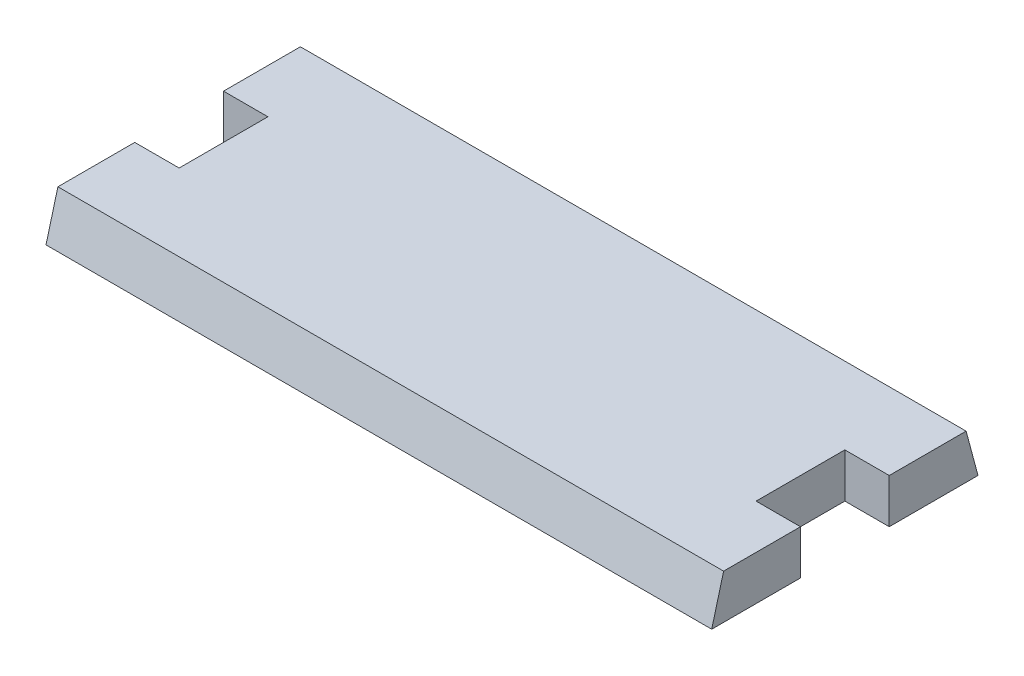
ISO-10303-21;
HEADER;
FILE_DESCRIPTION(('STEP AP214'),'2;1');
FILE_NAME('part.step','',(''),(''),'','','');
FILE_SCHEMA(('AUTOMOTIVE_DESIGN { 1 0 10303 214 1 1 1 1 }'));
ENDSEC;
DATA;
#1=APPLICATION_CONTEXT('core data for automotive mechanical design processes');
#2=APPLICATION_PROTOCOL_DEFINITION('international standard','automotive_design',2000,#1);
#3=PRODUCT_CONTEXT('',#1,'mechanical');
#4=PRODUCT('Part','Part','',(#3));
#5=PRODUCT_RELATED_PRODUCT_CATEGORY('part','',(#4));
#6=PRODUCT_DEFINITION_FORMATION('','',#4);
#7=PRODUCT_DEFINITION_CONTEXT('part definition',#1,'design');
#8=PRODUCT_DEFINITION('design','',#6,#7);
#9=PRODUCT_DEFINITION_SHAPE('','',#8);
#10=(LENGTH_UNIT() NAMED_UNIT(*) SI_UNIT(.MILLI.,.METRE.));
#11=(NAMED_UNIT(*) PLANE_ANGLE_UNIT() SI_UNIT($,.RADIAN.));
#12=(NAMED_UNIT(*) SI_UNIT($,.STERADIAN.) SOLID_ANGLE_UNIT());
#13=UNCERTAINTY_MEASURE_WITH_UNIT(LENGTH_MEASURE(1.E-05),#10,'distance_accuracy_value','');
#14=(GEOMETRIC_REPRESENTATION_CONTEXT(3) GLOBAL_UNCERTAINTY_ASSIGNED_CONTEXT((#13)) GLOBAL_UNIT_ASSIGNED_CONTEXT((#10,
#11,#12)) REPRESENTATION_CONTEXT('',''));
#15=CARTESIAN_POINT('',(0.,0.,0.));
#16=DIRECTION('',(0.,0.,1.));
#17=DIRECTION('',(1.,0.,0.));
#18=AXIS2_PLACEMENT_3D('',#15,#16,#17);
#19=CARTESIAN_POINT('',(-75.,0.,-30.));
#20=DIRECTION('',(0.,0.258819045102521,-0.965925826289068));
#21=DIRECTION('',(0.,0.965925826289068,0.258819045102521));
#22=AXIS2_PLACEMENT_3D('',#19,#20,#21);
#23=PLANE('',#22);
#24=DIRECTION('',(-1.,0.,0.));
#25=VECTOR('',#24,1.);
#26=CARTESIAN_POINT('',(-75.,0.,-30.));
#27=LINE('',#26,#25);
#28=CARTESIAN_POINT('',(75.,0.,-30.));
#29=VERTEX_POINT('',#28);
#30=CARTESIAN_POINT('',(-75.,0.,-30.));
#31=VERTEX_POINT('',#30);
#32=EDGE_CURVE('E150',#29,#31,#27,.T.);
#33=ORIENTED_EDGE('',*,*,#32,.T.);
#34=DIRECTION('',(0.,0.965925826289068,0.258819045102521));
#35=VECTOR('',#34,1.);
#36=CARTESIAN_POINT('',(-75.,14.3301270189222,-26.1602540378444));
#37=LINE('',#36,#35);
#38=CARTESIAN_POINT('',(-75.,10.,-27.3205080756888));
#39=VERTEX_POINT('',#38);
#40=EDGE_CURVE('E11',#39,#31,#37,.F.);
#41=ORIENTED_EDGE('',*,*,#40,.F.);
#42=DIRECTION('',(1.,0.,0.));
#43=VECTOR('',#42,1.);
#44=CARTESIAN_POINT('',(-75.,10.,-27.3205080756888));
#45=LINE('',#44,#43);
#46=CARTESIAN_POINT('',(75.,10.,-27.3205080756888));
#47=VERTEX_POINT('',#46);
#48=EDGE_CURVE('E145',#47,#39,#45,.F.);
#49=ORIENTED_EDGE('',*,*,#48,.F.);
#50=DIRECTION('',(0.,0.965925826289068,0.258819045102521));
#51=VECTOR('',#50,1.);
#52=CARTESIAN_POINT('',(75.,0.,-30.));
#53=LINE('',#52,#51);
#54=EDGE_CURVE('E139',#47,#29,#53,.F.);
#55=ORIENTED_EDGE('',*,*,#54,.T.);
#56=EDGE_LOOP('',(#33,#41,#49,#55));
#57=FACE_BOUND('',#56,.T.);
#58=ADVANCED_FACE('F39',(#57),#23,.T.);
#59=CARTESIAN_POINT('',(-75.,10.,-10.));
#60=DIRECTION('',(1.,0.,0.));
#61=DIRECTION('',(0.,0.,-1.));
#62=AXIS2_PLACEMENT_3D('',#59,#60,#61);
#63=PLANE('',#62);
#64=DIRECTION('',(0.,0.,1.));
#65=VECTOR('',#64,1.);
#66=CARTESIAN_POINT('',(-75.,0.,-10.));
#67=LINE('',#66,#65);
#68=CARTESIAN_POINT('',(-75.,0.,-10.));
#69=VERTEX_POINT('',#68);
#70=EDGE_CURVE('E155',#31,#69,#67,.T.);
#71=ORIENTED_EDGE('',*,*,#70,.T.);
#72=DIRECTION('',(0.,-1.,0.));
#73=VECTOR('',#72,1.);
#74=CARTESIAN_POINT('',(-75.,10.,-10.));
#75=LINE('',#74,#73);
#76=CARTESIAN_POINT('',(-75.,10.,-10.));
#77=VERTEX_POINT('',#76);
#78=EDGE_CURVE('E50',#77,#69,#75,.T.);
#79=ORIENTED_EDGE('',*,*,#78,.F.);
#80=DIRECTION('',(0.,0.,1.));
#81=VECTOR('',#80,1.);
#82=CARTESIAN_POINT('',(-75.,10.,-10.));
#83=LINE('',#82,#81);
#84=EDGE_CURVE('E219',#39,#77,#83,.T.);
#85=ORIENTED_EDGE('',*,*,#84,.F.);
#86=ORIENTED_EDGE('',*,*,#40,.T.);
#87=EDGE_LOOP('',(#71,#79,#85,#86));
#88=FACE_BOUND('',#87,.T.);
#89=ADVANCED_FACE('F278',(#88),#63,.F.);
#90=CARTESIAN_POINT('',(-75.,10.,-10.));
#91=DIRECTION('',(0.,0.,-1.));
#92=DIRECTION('',(-1.,0.,0.));
#93=AXIS2_PLACEMENT_3D('',#90,#91,#92);
#94=PLANE('',#93);
#95=DIRECTION('',(1.,0.,0.));
#96=VECTOR('',#95,1.);
#97=CARTESIAN_POINT('',(-75.,0.,-10.));
#98=LINE('',#97,#96);
#99=CARTESIAN_POINT('',(-65.,0.,-10.));
#100=VERTEX_POINT('',#99);
#101=EDGE_CURVE('E159',#69,#100,#98,.T.);
#102=ORIENTED_EDGE('',*,*,#101,.T.);
#103=DIRECTION('',(0.,-1.,0.));
#104=VECTOR('',#103,1.);
#105=CARTESIAN_POINT('',(-65.,10.,-10.));
#106=LINE('',#105,#104);
#107=CARTESIAN_POINT('',(-65.,10.,-10.));
#108=VERTEX_POINT('',#107);
#109=EDGE_CURVE('E211',#108,#100,#106,.T.);
#110=ORIENTED_EDGE('',*,*,#109,.F.);
#111=DIRECTION('',(1.,0.,0.));
#112=VECTOR('',#111,1.);
#113=CARTESIAN_POINT('',(-75.,10.,-10.));
#114=LINE('',#113,#112);
#115=EDGE_CURVE('E396',#77,#108,#114,.T.);
#116=ORIENTED_EDGE('',*,*,#115,.F.);
#117=ORIENTED_EDGE('',*,*,#78,.T.);
#118=EDGE_LOOP('',(#102,#110,#116,#117));
#119=FACE_BOUND('',#118,.T.);
#120=ADVANCED_FACE('F282',(#119),#94,.F.);
#121=CARTESIAN_POINT('',(-65.,10.,-10.));
#122=DIRECTION('',(1.,0.,0.));
#123=DIRECTION('',(0.,0.,-1.));
#124=AXIS2_PLACEMENT_3D('',#121,#122,#123);
#125=PLANE('',#124);
#126=DIRECTION('',(0.,0.,1.));
#127=VECTOR('',#126,1.);
#128=CARTESIAN_POINT('',(-65.,0.,-10.));
#129=LINE('',#128,#127);
#130=CARTESIAN_POINT('',(-65.,0.,9.99999999999999));
#131=VERTEX_POINT('',#130);
#132=EDGE_CURVE('E166',#100,#131,#129,.T.);
#133=ORIENTED_EDGE('',*,*,#132,.T.);
#134=DIRECTION('',(0.,-1.,0.));
#135=VECTOR('',#134,1.);
#136=CARTESIAN_POINT('',(-65.,10.,9.99999999999999));
#137=LINE('',#136,#135);
#138=CARTESIAN_POINT('',(-65.,10.,9.99999999999999));
#139=VERTEX_POINT('',#138);
#140=EDGE_CURVE('E206',#139,#131,#137,.T.);
#141=ORIENTED_EDGE('',*,*,#140,.F.);
#142=DIRECTION('',(0.,0.,1.));
#143=VECTOR('',#142,1.);
#144=CARTESIAN_POINT('',(-65.,10.,-10.));
#145=LINE('',#144,#143);
#146=EDGE_CURVE('E234',#108,#139,#145,.T.);
#147=ORIENTED_EDGE('',*,*,#146,.F.);
#148=ORIENTED_EDGE('',*,*,#109,.T.);
#149=EDGE_LOOP('',(#133,#141,#147,#148));
#150=FACE_BOUND('',#149,.T.);
#151=ADVANCED_FACE('F288',(#150),#125,.F.);
#152=CARTESIAN_POINT('',(-75.,10.,9.99999999999999));
#153=DIRECTION('',(0.,0.,1.));
#154=DIRECTION('',(1.,0.,0.));
#155=AXIS2_PLACEMENT_3D('',#152,#153,#154);
#156=PLANE('',#155);
#157=DIRECTION('',(-1.,0.,0.));
#158=VECTOR('',#157,1.);
#159=CARTESIAN_POINT('',(-75.,0.,9.99999999999999));
#160=LINE('',#159,#158);
#161=CARTESIAN_POINT('',(-75.,0.,9.99999999999999));
#162=VERTEX_POINT('',#161);
#163=EDGE_CURVE('E169',#131,#162,#160,.T.);
#164=ORIENTED_EDGE('',*,*,#163,.T.);
#165=DIRECTION('',(0.,-1.,0.));
#166=VECTOR('',#165,1.);
#167=CARTESIAN_POINT('',(-75.,10.,9.99999999999999));
#168=LINE('',#167,#166);
#169=CARTESIAN_POINT('',(-75.,10.,9.99999999999999));
#170=VERTEX_POINT('',#169);
#171=EDGE_CURVE('E202',#170,#162,#168,.T.);
#172=ORIENTED_EDGE('',*,*,#171,.F.);
#173=DIRECTION('',(-1.,0.,0.));
#174=VECTOR('',#173,1.);
#175=CARTESIAN_POINT('',(-75.,10.,9.99999999999999));
#176=LINE('',#175,#174);
#177=EDGE_CURVE('E83',#139,#170,#176,.T.);
#178=ORIENTED_EDGE('',*,*,#177,.F.);
#179=ORIENTED_EDGE('',*,*,#140,.T.);
#180=EDGE_LOOP('',(#164,#172,#178,#179));
#181=FACE_BOUND('',#180,.T.);
#182=ADVANCED_FACE('F292',(#181),#156,.F.);
#183=CARTESIAN_POINT('',(-75.,10.,30.));
#184=DIRECTION('',(1.,0.,0.));
#185=DIRECTION('',(0.,0.,-1.));
#186=AXIS2_PLACEMENT_3D('',#183,#184,#185);
#187=PLANE('',#186);
#188=DIRECTION('',(0.,0.,1.));
#189=VECTOR('',#188,1.);
#190=CARTESIAN_POINT('',(-75.,0.,30.));
#191=LINE('',#190,#189);
#192=CARTESIAN_POINT('',(-75.,0.,30.));
#193=VERTEX_POINT('',#192);
#194=EDGE_CURVE('E172',#162,#193,#191,.T.);
#195=ORIENTED_EDGE('',*,*,#194,.T.);
#196=DIRECTION('',(0.,0.965925826289068,-0.258819045102521));
#197=VECTOR('',#196,1.);
#198=CARTESIAN_POINT('',(-75.,0.,30.));
#199=LINE('',#198,#197);
#200=CARTESIAN_POINT('',(-75.,10.,27.3205080756888));
#201=VERTEX_POINT('',#200);
#202=EDGE_CURVE('E207',#201,#193,#199,.F.);
#203=ORIENTED_EDGE('',*,*,#202,.F.);
#204=DIRECTION('',(0.,0.,1.));
#205=VECTOR('',#204,1.);
#206=CARTESIAN_POINT('',(-75.,10.,30.));
#207=LINE('',#206,#205);
#208=EDGE_CURVE('E76',#170,#201,#207,.T.);
#209=ORIENTED_EDGE('',*,*,#208,.F.);
#210=ORIENTED_EDGE('',*,*,#171,.T.);
#211=EDGE_LOOP('',(#195,#203,#209,#210));
#212=FACE_BOUND('',#211,.T.);
#213=ADVANCED_FACE('F296',(#212),#187,.F.);
#214=CARTESIAN_POINT('',(-75.,0.,30.));
#215=DIRECTION('',(0.,0.258819045102521,0.965925826289068));
#216=DIRECTION('',(0.,-0.965925826289068,0.258819045102521));
#217=AXIS2_PLACEMENT_3D('',#214,#215,#216);
#218=PLANE('',#217);
#219=DIRECTION('',(1.,0.,0.));
#220=VECTOR('',#219,1.);
#221=CARTESIAN_POINT('',(-75.,0.,30.));
#222=LINE('',#221,#220);
#223=CARTESIAN_POINT('',(75.,0.,30.));
#224=VERTEX_POINT('',#223);
#225=EDGE_CURVE('E175',#193,#224,#222,.T.);
#226=ORIENTED_EDGE('',*,*,#225,.T.);
#227=DIRECTION('',(0.,0.965925826289068,-0.258819045102521));
#228=VECTOR('',#227,1.);
#229=CARTESIAN_POINT('',(75.,9.33012701892219,27.5));
#230=LINE('',#229,#228);
#231=CARTESIAN_POINT('',(75.,10.,27.3205080756888));
#232=VERTEX_POINT('',#231);
#233=EDGE_CURVE('E43',#232,#224,#230,.F.);
#234=ORIENTED_EDGE('',*,*,#233,.F.);
#235=DIRECTION('',(-1.,0.,0.));
#236=VECTOR('',#235,1.);
#237=CARTESIAN_POINT('',(-75.,10.,27.3205080756888));
#238=LINE('',#237,#236);
#239=EDGE_CURVE('E223',#201,#232,#238,.F.);
#240=ORIENTED_EDGE('',*,*,#239,.F.);
#241=ORIENTED_EDGE('',*,*,#202,.T.);
#242=EDGE_LOOP('',(#226,#234,#240,#241));
#243=FACE_BOUND('',#242,.T.);
#244=ADVANCED_FACE('F41',(#243),#218,.T.);
#245=CARTESIAN_POINT('',(75.,10.,30.));
#246=DIRECTION('',(-1.,0.,0.));
#247=DIRECTION('',(0.,0.,1.));
#248=AXIS2_PLACEMENT_3D('',#245,#246,#247);
#249=PLANE('',#248);
#250=DIRECTION('',(0.,0.,-1.));
#251=VECTOR('',#250,1.);
#252=CARTESIAN_POINT('',(75.,0.,30.));
#253=LINE('',#252,#251);
#254=CARTESIAN_POINT('',(75.,0.,10.));
#255=VERTEX_POINT('',#254);
#256=EDGE_CURVE('E178',#224,#255,#253,.T.);
#257=ORIENTED_EDGE('',*,*,#256,.T.);
#258=DIRECTION('',(0.,-1.,0.));
#259=VECTOR('',#258,1.);
#260=CARTESIAN_POINT('',(75.,10.,10.));
#261=LINE('',#260,#259);
#262=CARTESIAN_POINT('',(75.,10.,10.));
#263=VERTEX_POINT('',#262);
#264=EDGE_CURVE('E198',#263,#255,#261,.T.);
#265=ORIENTED_EDGE('',*,*,#264,.F.);
#266=DIRECTION('',(0.,0.,-1.));
#267=VECTOR('',#266,1.);
#268=CARTESIAN_POINT('',(75.,10.,30.));
#269=LINE('',#268,#267);
#270=EDGE_CURVE('E225',#232,#263,#269,.T.);
#271=ORIENTED_EDGE('',*,*,#270,.F.);
#272=ORIENTED_EDGE('',*,*,#233,.T.);
#273=EDGE_LOOP('',(#257,#265,#271,#272));
#274=FACE_BOUND('',#273,.T.);
#275=ADVANCED_FACE('F251',(#274),#249,.F.);
#276=CARTESIAN_POINT('',(75.,10.,10.));
#277=DIRECTION('',(0.,0.,1.));
#278=DIRECTION('',(1.,0.,0.));
#279=AXIS2_PLACEMENT_3D('',#276,#277,#278);
#280=PLANE('',#279);
#281=DIRECTION('',(-1.,0.,0.));
#282=VECTOR('',#281,1.);
#283=CARTESIAN_POINT('',(75.,0.,10.));
#284=LINE('',#283,#282);
#285=CARTESIAN_POINT('',(65.,0.,10.));
#286=VERTEX_POINT('',#285);
#287=EDGE_CURVE('E181',#255,#286,#284,.T.);
#288=ORIENTED_EDGE('',*,*,#287,.T.);
#289=DIRECTION('',(0.,-1.,0.));
#290=VECTOR('',#289,1.);
#291=CARTESIAN_POINT('',(65.,10.,10.));
#292=LINE('',#291,#290);
#293=CARTESIAN_POINT('',(65.,10.,10.));
#294=VERTEX_POINT('',#293);
#295=EDGE_CURVE('E194',#294,#286,#292,.T.);
#296=ORIENTED_EDGE('',*,*,#295,.F.);
#297=DIRECTION('',(-1.,0.,0.));
#298=VECTOR('',#297,1.);
#299=CARTESIAN_POINT('',(75.,10.,10.));
#300=LINE('',#299,#298);
#301=EDGE_CURVE('E230',#263,#294,#300,.T.);
#302=ORIENTED_EDGE('',*,*,#301,.F.);
#303=ORIENTED_EDGE('',*,*,#264,.T.);
#304=EDGE_LOOP('',(#288,#296,#302,#303));
#305=FACE_BOUND('',#304,.T.);
#306=ADVANCED_FACE('F260',(#305),#280,.F.);
#307=CARTESIAN_POINT('',(65.,10.,-10.));
#308=DIRECTION('',(-1.,0.,0.));
#309=DIRECTION('',(0.,0.,1.));
#310=AXIS2_PLACEMENT_3D('',#307,#308,#309);
#311=PLANE('',#310);
#312=DIRECTION('',(0.,0.,-1.));
#313=VECTOR('',#312,1.);
#314=CARTESIAN_POINT('',(65.,0.,-10.));
#315=LINE('',#314,#313);
#316=CARTESIAN_POINT('',(65.,0.,-10.));
#317=VERTEX_POINT('',#316);
#318=EDGE_CURVE('E184',#286,#317,#315,.T.);
#319=ORIENTED_EDGE('',*,*,#318,.T.);
#320=DIRECTION('',(0.,-1.,0.));
#321=VECTOR('',#320,1.);
#322=CARTESIAN_POINT('',(65.,10.,-10.));
#323=LINE('',#322,#321);
#324=CARTESIAN_POINT('',(65.,10.,-10.));
#325=VERTEX_POINT('',#324);
#326=EDGE_CURVE('E191',#325,#317,#323,.T.);
#327=ORIENTED_EDGE('',*,*,#326,.F.);
#328=DIRECTION('',(0.,0.,-1.));
#329=VECTOR('',#328,1.);
#330=CARTESIAN_POINT('',(65.,10.,-10.));
#331=LINE('',#330,#329);
#332=EDGE_CURVE('E240',#294,#325,#331,.T.);
#333=ORIENTED_EDGE('',*,*,#332,.F.);
#334=ORIENTED_EDGE('',*,*,#295,.T.);
#335=EDGE_LOOP('',(#319,#327,#333,#334));
#336=FACE_BOUND('',#335,.T.);
#337=ADVANCED_FACE('F264',(#336),#311,.F.);
#338=CARTESIAN_POINT('',(75.,10.,-10.));
#339=DIRECTION('',(0.,0.,-1.));
#340=DIRECTION('',(-1.,0.,0.));
#341=AXIS2_PLACEMENT_3D('',#338,#339,#340);
#342=PLANE('',#341);
#343=DIRECTION('',(1.,0.,0.));
#344=VECTOR('',#343,1.);
#345=CARTESIAN_POINT('',(75.,0.,-10.));
#346=LINE('',#345,#344);
#347=CARTESIAN_POINT('',(75.,0.,-10.));
#348=VERTEX_POINT('',#347);
#349=EDGE_CURVE('E131',#317,#348,#346,.T.);
#350=ORIENTED_EDGE('',*,*,#349,.T.);
#351=DIRECTION('',(0.,-1.,0.));
#352=VECTOR('',#351,1.);
#353=CARTESIAN_POINT('',(75.,10.,-10.));
#354=LINE('',#353,#352);
#355=CARTESIAN_POINT('',(75.,10.,-10.));
#356=VERTEX_POINT('',#355);
#357=EDGE_CURVE('E141',#356,#348,#354,.T.);
#358=ORIENTED_EDGE('',*,*,#357,.F.);
#359=DIRECTION('',(1.,0.,0.));
#360=VECTOR('',#359,1.);
#361=CARTESIAN_POINT('',(75.,10.,-10.));
#362=LINE('',#361,#360);
#363=EDGE_CURVE('E242',#325,#356,#362,.T.);
#364=ORIENTED_EDGE('',*,*,#363,.F.);
#365=ORIENTED_EDGE('',*,*,#326,.T.);
#366=EDGE_LOOP('',(#350,#358,#364,#365));
#367=FACE_BOUND('',#366,.T.);
#368=ADVANCED_FACE('F275',(#367),#342,.F.);
#369=CARTESIAN_POINT('',(75.,10.,-10.));
#370=DIRECTION('',(-1.,0.,0.));
#371=DIRECTION('',(0.,0.,1.));
#372=AXIS2_PLACEMENT_3D('',#369,#370,#371);
#373=PLANE('',#372);
#374=DIRECTION('',(0.,0.,-1.));
#375=VECTOR('',#374,1.);
#376=CARTESIAN_POINT('',(75.,0.,-10.));
#377=LINE('',#376,#375);
#378=EDGE_CURVE('E136',#348,#29,#377,.T.);
#379=ORIENTED_EDGE('',*,*,#378,.T.);
#380=ORIENTED_EDGE('',*,*,#54,.F.);
#381=DIRECTION('',(0.,0.,-1.));
#382=VECTOR('',#381,1.);
#383=CARTESIAN_POINT('',(75.,10.,-10.));
#384=LINE('',#383,#382);
#385=EDGE_CURVE('E59',#356,#47,#384,.T.);
#386=ORIENTED_EDGE('',*,*,#385,.F.);
#387=ORIENTED_EDGE('',*,*,#357,.T.);
#388=EDGE_LOOP('',(#379,#380,#386,#387));
#389=FACE_BOUND('',#388,.T.);
#390=ADVANCED_FACE('F138',(#389),#373,.F.);
#391=CARTESIAN_POINT('',(0.,10.,0.));
#392=DIRECTION('',(0.,1.,0.));
#393=DIRECTION('',(0.,0.,1.));
#394=AXIS2_PLACEMENT_3D('',#391,#392,#393);
#395=PLANE('',#394);
#396=ORIENTED_EDGE('',*,*,#48,.T.);
#397=ORIENTED_EDGE('',*,*,#84,.T.);
#398=ORIENTED_EDGE('',*,*,#115,.T.);
#399=ORIENTED_EDGE('',*,*,#146,.T.);
#400=ORIENTED_EDGE('',*,*,#177,.T.);
#401=ORIENTED_EDGE('',*,*,#208,.T.);
#402=ORIENTED_EDGE('',*,*,#239,.T.);
#403=ORIENTED_EDGE('',*,*,#270,.T.);
#404=ORIENTED_EDGE('',*,*,#301,.T.);
#405=ORIENTED_EDGE('',*,*,#332,.T.);
#406=ORIENTED_EDGE('',*,*,#363,.T.);
#407=ORIENTED_EDGE('',*,*,#385,.T.);
#408=EDGE_LOOP('',(#396,#397,#398,#399,#400,#401,#402,#403,#404,#405,#406,#407));
#409=FACE_BOUND('',#408,.T.);
#410=ADVANCED_FACE('F266',(#409),#395,.T.);
#411=CARTESIAN_POINT('',(0.,0.,0.));
#412=DIRECTION('',(0.,1.,0.));
#413=DIRECTION('',(0.,0.,1.));
#414=AXIS2_PLACEMENT_3D('',#411,#412,#413);
#415=PLANE('',#414);
#416=ORIENTED_EDGE('',*,*,#32,.F.);
#417=ORIENTED_EDGE('',*,*,#378,.F.);
#418=ORIENTED_EDGE('',*,*,#349,.F.);
#419=ORIENTED_EDGE('',*,*,#318,.F.);
#420=ORIENTED_EDGE('',*,*,#287,.F.);
#421=ORIENTED_EDGE('',*,*,#256,.F.);
#422=ORIENTED_EDGE('',*,*,#225,.F.);
#423=ORIENTED_EDGE('',*,*,#194,.F.);
#424=ORIENTED_EDGE('',*,*,#163,.F.);
#425=ORIENTED_EDGE('',*,*,#132,.F.);
#426=ORIENTED_EDGE('',*,*,#101,.F.);
#427=ORIENTED_EDGE('',*,*,#70,.F.);
#428=EDGE_LOOP('',(#416,#417,#418,#419,#420,#421,#422,#423,#424,#425,#426,#427));
#429=FACE_BOUND('',#428,.T.);
#430=ADVANCED_FACE('F153',(#429),#415,.F.);
#431=CLOSED_SHELL('',(#58,#89,#120,#151,#182,#213,#244,#275,#306,#337,#368,#390,#410,#430));
#432=MANIFOLD_SOLID_BREP('B2',#431);
#433=ADVANCED_BREP_SHAPE_REPRESENTATION('',(#18,#432),#14);
#434=SHAPE_DEFINITION_REPRESENTATION(#9,#433);
ENDSEC;
END-ISO-10303-21;
